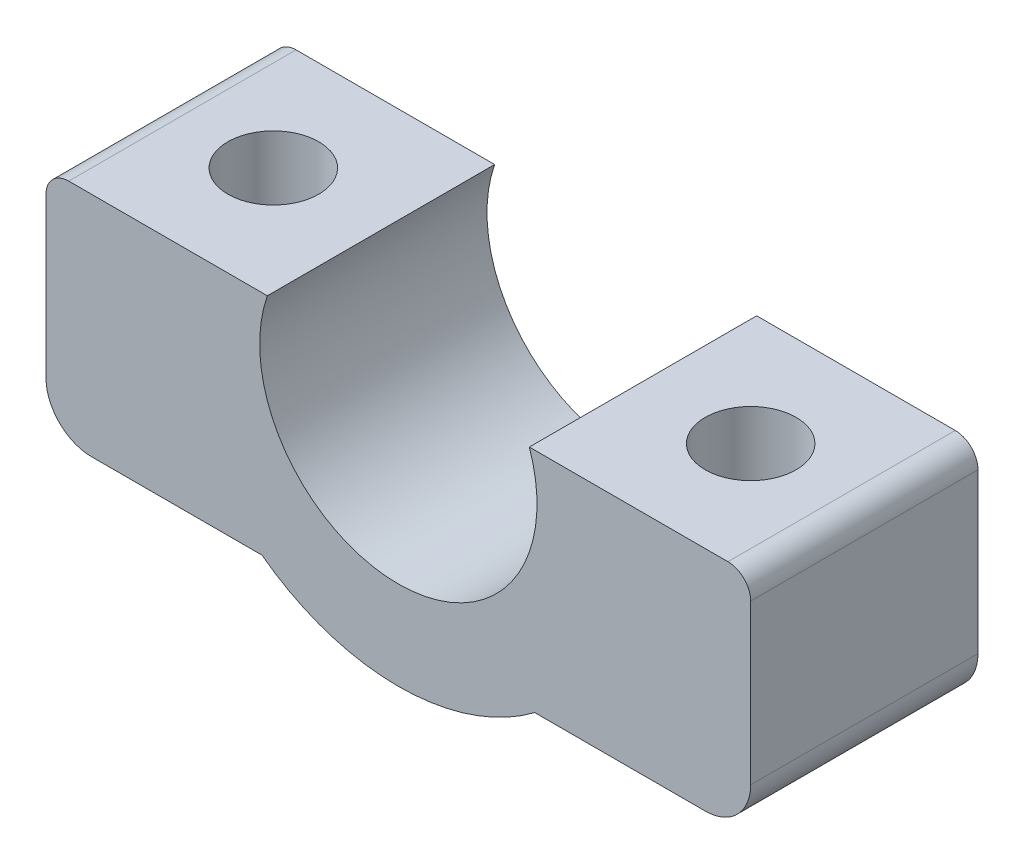
ISO-10303-21;
HEADER;
FILE_DESCRIPTION(('STEP AP214'),'2;1');
FILE_NAME('part.step','',(''),(''),'','','');
FILE_SCHEMA(('AUTOMOTIVE_DESIGN { 1 0 10303 214 1 1 1 1 }'));
ENDSEC;
DATA;
#1=APPLICATION_CONTEXT('core data for automotive mechanical design processes');
#2=APPLICATION_PROTOCOL_DEFINITION('international standard','automotive_design',2000,#1);
#3=PRODUCT_CONTEXT('',#1,'mechanical');
#4=PRODUCT('Part','Part','',(#3));
#5=PRODUCT_RELATED_PRODUCT_CATEGORY('part','',(#4));
#6=PRODUCT_DEFINITION_FORMATION('','',#4);
#7=PRODUCT_DEFINITION_CONTEXT('part definition',#1,'design');
#8=PRODUCT_DEFINITION('design','',#6,#7);
#9=PRODUCT_DEFINITION_SHAPE('','',#8);
#10=(LENGTH_UNIT() NAMED_UNIT(*) SI_UNIT(.MILLI.,.METRE.));
#11=(NAMED_UNIT(*) PLANE_ANGLE_UNIT() SI_UNIT($,.RADIAN.));
#12=(NAMED_UNIT(*) SI_UNIT($,.STERADIAN.) SOLID_ANGLE_UNIT());
#13=UNCERTAINTY_MEASURE_WITH_UNIT(LENGTH_MEASURE(1.E-05),#10,'distance_accuracy_value','');
#14=(GEOMETRIC_REPRESENTATION_CONTEXT(3) GLOBAL_UNCERTAINTY_ASSIGNED_CONTEXT((#13)) GLOBAL_UNIT_ASSIGNED_CONTEXT((#10,
#11,#12)) REPRESENTATION_CONTEXT('',''));
#15=CARTESIAN_POINT('',(0.,0.,0.));
#16=DIRECTION('',(0.,0.,1.));
#17=DIRECTION('',(1.,0.,0.));
#18=AXIS2_PLACEMENT_3D('',#15,#16,#17);
#19=CARTESIAN_POINT('',(-15.3242534559657,-8.,0.));
#20=DIRECTION('',(0.,1.,0.));
#21=DIRECTION('',(0.,0.,1.));
#22=AXIS2_PLACEMENT_3D('',#19,#20,#21);
#23=PLANE('',#22);
#24=CARTESIAN_POINT('',(-10.5,-8.,5.));
#25=DIRECTION('',(0.,1.,0.));
#26=DIRECTION('',(0.,0.,1.));
#27=AXIS2_PLACEMENT_3D('',#24,#25,#26);
#28=CIRCLE('',#27,2.);
#29=CARTESIAN_POINT('',(-10.5,-8.,7.));
#30=VERTEX_POINT('',#29);
#31=EDGE_CURVE('E171',#30,#30,#28,.F.);
#32=ORIENTED_EDGE('',*,*,#31,.F.);
#33=EDGE_LOOP('',(#32));
#34=FACE_BOUND('',#33,.T.);
#35=DIRECTION('',(-1.,0.,0.));
#36=VECTOR('',#35,1.);
#37=CARTESIAN_POINT('',(-15.3242534559657,-8.,10.));
#38=LINE('',#37,#36);
#39=CARTESIAN_POINT('',(-6.,-8.,10.));
#40=VERTEX_POINT('',#39);
#41=CARTESIAN_POINT('',(-13.5,-8.,10.));
#42=VERTEX_POINT('',#41);
#43=EDGE_CURVE('E140',#40,#42,#38,.T.);
#44=ORIENTED_EDGE('',*,*,#43,.T.);
#45=DIRECTION('',(0.,0.,1.));
#46=VECTOR('',#45,1.);
#47=CARTESIAN_POINT('',(-13.5,-8.,0.));
#48=LINE('',#47,#46);
#49=CARTESIAN_POINT('',(-13.5,-8.,0.));
#50=VERTEX_POINT('',#49);
#51=EDGE_CURVE('E208',#42,#50,#48,.F.);
#52=ORIENTED_EDGE('',*,*,#51,.T.);
#53=DIRECTION('',(-1.,0.,0.));
#54=VECTOR('',#53,1.);
#55=CARTESIAN_POINT('',(-15.3242534559657,-8.,0.));
#56=LINE('',#55,#54);
#57=CARTESIAN_POINT('',(-6.,-8.,0.));
#58=VERTEX_POINT('',#57);
#59=EDGE_CURVE('E139',#58,#50,#56,.T.);
#60=ORIENTED_EDGE('',*,*,#59,.F.);
#61=DIRECTION('',(0.,0.,1.));
#62=VECTOR('',#61,1.);
#63=CARTESIAN_POINT('',(-6.,-8.,-12.1655250605964));
#64=LINE('',#63,#62);
#65=EDGE_CURVE('E149',#58,#40,#64,.T.);
#66=ORIENTED_EDGE('',*,*,#65,.T.);
#67=EDGE_LOOP('',(#44,#52,#60,#66));
#68=FACE_BOUND('',#67,.T.);
#69=ADVANCED_FACE('F38',(#34,#68),#23,.F.);
#70=CARTESIAN_POINT('',(0.,0.,10.));
#71=DIRECTION('',(0.,0.,1.));
#72=DIRECTION('',(1.,0.,0.));
#73=AXIS2_PLACEMENT_3D('',#70,#71,#72);
#74=PLANE('',#73);
#75=DIRECTION('',(1.,0.,0.));
#76=VECTOR('',#75,1.);
#77=CARTESIAN_POINT('',(-19.8541118207016,2.,10.));
#78=LINE('',#77,#76);
#79=CARTESIAN_POINT('',(-14.5,2.,10.));
#80=VERTEX_POINT('',#79);
#81=CARTESIAN_POINT('',(-5.76281181368956,2.,10.));
#82=VERTEX_POINT('',#81);
#83=EDGE_CURVE('E185',#80,#82,#78,.T.);
#84=ORIENTED_EDGE('',*,*,#83,.F.);
#85=CARTESIAN_POINT('',(-14.5,1.,10.));
#86=DIRECTION('',(0.,0.,1.));
#87=DIRECTION('',(1.,0.,0.));
#88=AXIS2_PLACEMENT_3D('',#85,#86,#87);
#89=CIRCLE('',#88,1.);
#90=CARTESIAN_POINT('',(-15.5,1.,10.));
#91=VERTEX_POINT('',#90);
#92=EDGE_CURVE('E222',#80,#91,#89,.T.);
#93=ORIENTED_EDGE('',*,*,#92,.T.);
#94=DIRECTION('',(0.,-1.,0.));
#95=VECTOR('',#94,1.);
#96=CARTESIAN_POINT('',(-15.5,0.,10.));
#97=LINE('',#96,#95);
#98=CARTESIAN_POINT('',(-15.5,-6.,10.));
#99=VERTEX_POINT('',#98);
#100=EDGE_CURVE('E161',#91,#99,#97,.T.);
#101=ORIENTED_EDGE('',*,*,#100,.T.);
#102=CARTESIAN_POINT('',(-13.5,-6.,10.));
#103=DIRECTION('',(0.,0.,1.));
#104=DIRECTION('',(1.,0.,0.));
#105=AXIS2_PLACEMENT_3D('',#102,#103,#104);
#106=CIRCLE('',#105,2.);
#107=EDGE_CURVE('E206',#99,#42,#106,.T.);
#108=ORIENTED_EDGE('',*,*,#107,.T.);
#109=ORIENTED_EDGE('',*,*,#43,.F.);
#110=CARTESIAN_POINT('',(0.,0.,10.));
#111=DIRECTION('',(0.,0.,1.));
#112=DIRECTION('',(1.,0.,0.));
#113=AXIS2_PLACEMENT_3D('',#110,#111,#112);
#114=CIRCLE('',#113,10.);
#115=CARTESIAN_POINT('',(6.,-8.,10.));
#116=VERTEX_POINT('',#115);
#117=EDGE_CURVE('E145',#40,#116,#114,.T.);
#118=ORIENTED_EDGE('',*,*,#117,.T.);
#119=CARTESIAN_POINT('',(13.5,-8.,10.));
#120=VERTEX_POINT('',#119);
#121=EDGE_CURVE('E129',#120,#116,#38,.T.);
#122=ORIENTED_EDGE('',*,*,#121,.F.);
#123=CARTESIAN_POINT('',(13.5,-6.,10.));
#124=DIRECTION('',(0.,0.,1.));
#125=DIRECTION('',(1.,0.,0.));
#126=AXIS2_PLACEMENT_3D('',#123,#124,#125);
#127=CIRCLE('',#126,2.);
#128=CARTESIAN_POINT('',(15.5,-6.,10.));
#129=VERTEX_POINT('',#128);
#130=EDGE_CURVE('E204',#120,#129,#127,.T.);
#131=ORIENTED_EDGE('',*,*,#130,.T.);
#132=DIRECTION('',(0.,-1.,0.));
#133=VECTOR('',#132,1.);
#134=CARTESIAN_POINT('',(15.5,0.,10.));
#135=LINE('',#134,#133);
#136=CARTESIAN_POINT('',(15.5,1.,10.));
#137=VERTEX_POINT('',#136);
#138=EDGE_CURVE('E162',#137,#129,#135,.T.);
#139=ORIENTED_EDGE('',*,*,#138,.F.);
#140=CARTESIAN_POINT('',(14.5,1.,10.));
#141=DIRECTION('',(0.,0.,1.));
#142=DIRECTION('',(1.,0.,0.));
#143=AXIS2_PLACEMENT_3D('',#140,#141,#142);
#144=CIRCLE('',#143,1.);
#145=CARTESIAN_POINT('',(14.5,2.,10.));
#146=VERTEX_POINT('',#145);
#147=EDGE_CURVE('E220',#137,#146,#144,.T.);
#148=ORIENTED_EDGE('',*,*,#147,.T.);
#149=DIRECTION('',(1.,0.,0.));
#150=VECTOR('',#149,1.);
#151=CARTESIAN_POINT('',(5.76281181368956,2.,10.));
#152=LINE('',#151,#150);
#153=CARTESIAN_POINT('',(5.76281181368956,2.,10.));
#154=VERTEX_POINT('',#153);
#155=EDGE_CURVE('E190',#154,#146,#152,.T.);
#156=ORIENTED_EDGE('',*,*,#155,.F.);
#157=CARTESIAN_POINT('',(0.,0.,10.));
#158=DIRECTION('',(0.,0.,1.));
#159=DIRECTION('',(1.,0.,0.));
#160=AXIS2_PLACEMENT_3D('',#157,#158,#159);
#161=CIRCLE('',#160,6.1);
#162=EDGE_CURVE('E180',#82,#154,#161,.T.);
#163=ORIENTED_EDGE('',*,*,#162,.F.);
#164=EDGE_LOOP('',(#84,#93,#101,#108,#109,#118,#122,#131,#139,#148,#156,#163));
#165=FACE_BOUND('',#164,.T.);
#166=ADVANCED_FACE('F153',(#165),#74,.T.);
#167=CARTESIAN_POINT('',(0.,0.,0.));
#168=DIRECTION('',(0.,0.,1.));
#169=DIRECTION('',(1.,0.,0.));
#170=AXIS2_PLACEMENT_3D('',#167,#168,#169);
#171=PLANE('',#170);
#172=DIRECTION('',(0.,1.,0.));
#173=VECTOR('',#172,1.);
#174=CARTESIAN_POINT('',(-15.5,0.,0.));
#175=LINE('',#174,#173);
#176=CARTESIAN_POINT('',(-15.5,-6.,0.));
#177=VERTEX_POINT('',#176);
#178=CARTESIAN_POINT('',(-15.5,1.,0.));
#179=VERTEX_POINT('',#178);
#180=EDGE_CURVE('E164',#177,#179,#175,.T.);
#181=ORIENTED_EDGE('',*,*,#180,.T.);
#182=CARTESIAN_POINT('',(-14.5,1.,0.));
#183=DIRECTION('',(0.,0.,1.));
#184=DIRECTION('',(1.,0.,0.));
#185=AXIS2_PLACEMENT_3D('',#182,#183,#184);
#186=CIRCLE('',#185,1.);
#187=CARTESIAN_POINT('',(-14.5,2.,0.));
#188=VERTEX_POINT('',#187);
#189=EDGE_CURVE('E227',#179,#188,#186,.F.);
#190=ORIENTED_EDGE('',*,*,#189,.T.);
#191=DIRECTION('',(1.,0.,0.));
#192=VECTOR('',#191,1.);
#193=CARTESIAN_POINT('',(0.,2.,0.));
#194=LINE('',#193,#192);
#195=CARTESIAN_POINT('',(-5.76281181368956,2.,0.));
#196=VERTEX_POINT('',#195);
#197=EDGE_CURVE('E196',#188,#196,#194,.T.);
#198=ORIENTED_EDGE('',*,*,#197,.T.);
#199=CARTESIAN_POINT('',(0.,0.,0.));
#200=DIRECTION('',(0.,0.,1.));
#201=DIRECTION('',(1.,0.,0.));
#202=AXIS2_PLACEMENT_3D('',#199,#200,#201);
#203=CIRCLE('',#202,6.1);
#204=CARTESIAN_POINT('',(5.76281181368956,2.,0.));
#205=VERTEX_POINT('',#204);
#206=EDGE_CURVE('E181',#196,#205,#203,.T.);
#207=ORIENTED_EDGE('',*,*,#206,.T.);
#208=DIRECTION('',(1.,0.,0.));
#209=VECTOR('',#208,1.);
#210=CARTESIAN_POINT('',(5.76281181368956,2.,0.));
#211=LINE('',#210,#209);
#212=CARTESIAN_POINT('',(14.5,2.,0.));
#213=VERTEX_POINT('',#212);
#214=EDGE_CURVE('E184',#205,#213,#211,.T.);
#215=ORIENTED_EDGE('',*,*,#214,.T.);
#216=CARTESIAN_POINT('',(14.5,1.,0.));
#217=DIRECTION('',(0.,0.,1.));
#218=DIRECTION('',(1.,0.,0.));
#219=AXIS2_PLACEMENT_3D('',#216,#217,#218);
#220=CIRCLE('',#219,1.);
#221=CARTESIAN_POINT('',(15.5,1.,0.));
#222=VERTEX_POINT('',#221);
#223=EDGE_CURVE('E53',#213,#222,#220,.F.);
#224=ORIENTED_EDGE('',*,*,#223,.T.);
#225=DIRECTION('',(0.,1.,0.));
#226=VECTOR('',#225,1.);
#227=CARTESIAN_POINT('',(15.5,0.,0.));
#228=LINE('',#227,#226);
#229=CARTESIAN_POINT('',(15.5,-6.,0.));
#230=VERTEX_POINT('',#229);
#231=EDGE_CURVE('E159',#230,#222,#228,.T.);
#232=ORIENTED_EDGE('',*,*,#231,.F.);
#233=CARTESIAN_POINT('',(13.5,-6.,0.));
#234=DIRECTION('',(0.,0.,1.));
#235=DIRECTION('',(1.,0.,0.));
#236=AXIS2_PLACEMENT_3D('',#233,#234,#235);
#237=CIRCLE('',#236,2.);
#238=CARTESIAN_POINT('',(13.5,-8.,0.));
#239=VERTEX_POINT('',#238);
#240=EDGE_CURVE('E210',#230,#239,#237,.F.);
#241=ORIENTED_EDGE('',*,*,#240,.T.);
#242=CARTESIAN_POINT('',(6.,-8.,0.));
#243=VERTEX_POINT('',#242);
#244=EDGE_CURVE('E168',#239,#243,#56,.T.);
#245=ORIENTED_EDGE('',*,*,#244,.T.);
#246=CARTESIAN_POINT('',(0.,0.,0.));
#247=DIRECTION('',(0.,0.,1.));
#248=DIRECTION('',(1.,0.,0.));
#249=AXIS2_PLACEMENT_3D('',#246,#247,#248);
#250=CIRCLE('',#249,10.);
#251=EDGE_CURVE('E148',#243,#58,#250,.F.);
#252=ORIENTED_EDGE('',*,*,#251,.T.);
#253=ORIENTED_EDGE('',*,*,#59,.T.);
#254=CARTESIAN_POINT('',(-13.5,-6.,0.));
#255=DIRECTION('',(0.,0.,1.));
#256=DIRECTION('',(1.,0.,0.));
#257=AXIS2_PLACEMENT_3D('',#254,#255,#256);
#258=CIRCLE('',#257,2.);
#259=EDGE_CURVE('E212',#50,#177,#258,.F.);
#260=ORIENTED_EDGE('',*,*,#259,.T.);
#261=EDGE_LOOP('',(#181,#190,#198,#207,#215,#224,#232,#241,#245,#252,#253,#260));
#262=FACE_BOUND('',#261,.T.);
#263=ADVANCED_FACE('F239',(#262),#171,.F.);
#264=CARTESIAN_POINT('',(-19.8541118207016,2.,0.));
#265=DIRECTION('',(0.,-1.,0.));
#266=DIRECTION('',(0.,0.,-1.));
#267=AXIS2_PLACEMENT_3D('',#264,#265,#266);
#268=PLANE('',#267);
#269=CARTESIAN_POINT('',(-10.5,2.,5.));
#270=DIRECTION('',(0.,1.,0.));
#271=DIRECTION('',(0.,0.,1.));
#272=AXIS2_PLACEMENT_3D('',#269,#270,#271);
#273=CIRCLE('',#272,2.);
#274=CARTESIAN_POINT('',(-10.5,2.,7.));
#275=VERTEX_POINT('',#274);
#276=EDGE_CURVE('E177',#275,#275,#273,.T.);
#277=ORIENTED_EDGE('',*,*,#276,.F.);
#278=EDGE_LOOP('',(#277));
#279=FACE_BOUND('',#278,.T.);
#280=ORIENTED_EDGE('',*,*,#197,.F.);
#281=DIRECTION('',(0.,0.,1.));
#282=VECTOR('',#281,1.);
#283=CARTESIAN_POINT('',(-14.5,2.,10.));
#284=LINE('',#283,#282);
#285=EDGE_CURVE('E217',#188,#80,#284,.T.);
#286=ORIENTED_EDGE('',*,*,#285,.T.);
#287=ORIENTED_EDGE('',*,*,#83,.T.);
#288=DIRECTION('',(0.,0.,1.));
#289=VECTOR('',#288,1.);
#290=CARTESIAN_POINT('',(-5.76281181368956,2.,0.));
#291=LINE('',#290,#289);
#292=EDGE_CURVE('E193',#196,#82,#291,.T.);
#293=ORIENTED_EDGE('',*,*,#292,.F.);
#294=EDGE_LOOP('',(#280,#286,#287,#293));
#295=FACE_BOUND('',#294,.T.);
#296=ADVANCED_FACE('F261',(#279,#295),#268,.F.);
#297=CARTESIAN_POINT('',(5.76281181368956,2.,0.));
#298=DIRECTION('',(0.,-1.,0.));
#299=DIRECTION('',(0.,0.,-1.));
#300=AXIS2_PLACEMENT_3D('',#297,#298,#299);
#301=PLANE('',#300);
#302=CARTESIAN_POINT('',(10.5,2.,5.));
#303=DIRECTION('',(0.,1.,0.));
#304=DIRECTION('',(0.,0.,1.));
#305=AXIS2_PLACEMENT_3D('',#302,#303,#304);
#306=CIRCLE('',#305,2.);
#307=CARTESIAN_POINT('',(10.5,2.,7.));
#308=VERTEX_POINT('',#307);
#309=EDGE_CURVE('E174',#308,#308,#306,.T.);
#310=ORIENTED_EDGE('',*,*,#309,.F.);
#311=EDGE_LOOP('',(#310));
#312=FACE_BOUND('',#311,.T.);
#313=ORIENTED_EDGE('',*,*,#155,.T.);
#314=DIRECTION('',(0.,0.,1.));
#315=VECTOR('',#314,1.);
#316=CARTESIAN_POINT('',(14.5,2.,0.));
#317=LINE('',#316,#315);
#318=EDGE_CURVE('E11',#146,#213,#317,.F.);
#319=ORIENTED_EDGE('',*,*,#318,.T.);
#320=ORIENTED_EDGE('',*,*,#214,.F.);
#321=DIRECTION('',(0.,0.,1.));
#322=VECTOR('',#321,1.);
#323=CARTESIAN_POINT('',(5.76281181368956,2.,0.));
#324=LINE('',#323,#322);
#325=EDGE_CURVE('E187',#205,#154,#324,.T.);
#326=ORIENTED_EDGE('',*,*,#325,.T.);
#327=EDGE_LOOP('',(#313,#319,#320,#326));
#328=FACE_BOUND('',#327,.T.);
#329=ADVANCED_FACE('F293',(#312,#328),#301,.F.);
#330=CARTESIAN_POINT('',(0.,0.,0.));
#331=DIRECTION('',(0.,0.,1.));
#332=DIRECTION('',(1.,0.,0.));
#333=AXIS2_PLACEMENT_3D('',#330,#331,#332);
#334=CYLINDRICAL_SURFACE('',#333,6.1);
#335=ORIENTED_EDGE('',*,*,#162,.T.);
#336=ORIENTED_EDGE('',*,*,#325,.F.);
#337=ORIENTED_EDGE('',*,*,#206,.F.);
#338=ORIENTED_EDGE('',*,*,#292,.T.);
#339=EDGE_LOOP('',(#335,#336,#337,#338));
#340=FACE_BOUND('',#339,.T.);
#341=ADVANCED_FACE('F265',(#340),#334,.F.);
#342=CARTESIAN_POINT('',(-10.5,-15.,5.));
#343=DIRECTION('',(0.,1.,0.));
#344=DIRECTION('',(0.,0.,1.));
#345=AXIS2_PLACEMENT_3D('',#342,#343,#344);
#346=CYLINDRICAL_SURFACE('',#345,2.);
#347=ORIENTED_EDGE('',*,*,#31,.T.);
#348=EDGE_LOOP('',(#347));
#349=FACE_BOUND('',#348,.T.);
#350=ORIENTED_EDGE('',*,*,#276,.T.);
#351=EDGE_LOOP('',(#350));
#352=FACE_BOUND('',#351,.T.);
#353=ADVANCED_FACE('F287',(#349,#352),#346,.F.);
#354=CARTESIAN_POINT('',(10.5,-15.,5.));
#355=DIRECTION('',(0.,1.,0.));
#356=DIRECTION('',(0.,0.,1.));
#357=AXIS2_PLACEMENT_3D('',#354,#355,#356);
#358=CYLINDRICAL_SURFACE('',#357,2.);
#359=CARTESIAN_POINT('',(10.5,-8.,5.));
#360=DIRECTION('',(0.,1.,0.));
#361=DIRECTION('',(0.,0.,1.));
#362=AXIS2_PLACEMENT_3D('',#359,#360,#361);
#363=CIRCLE('',#362,2.);
#364=CARTESIAN_POINT('',(10.5,-8.,7.));
#365=VERTEX_POINT('',#364);
#366=EDGE_CURVE('E169',#365,#365,#363,.F.);
#367=ORIENTED_EDGE('',*,*,#366,.T.);
#368=EDGE_LOOP('',(#367));
#369=FACE_BOUND('',#368,.T.);
#370=ORIENTED_EDGE('',*,*,#309,.T.);
#371=EDGE_LOOP('',(#370));
#372=FACE_BOUND('',#371,.T.);
#373=ADVANCED_FACE('F281',(#369,#372),#358,.F.);
#374=ORIENTED_EDGE('',*,*,#366,.F.);
#375=EDGE_LOOP('',(#374));
#376=FACE_BOUND('',#375,.T.);
#377=ORIENTED_EDGE('',*,*,#244,.F.);
#378=DIRECTION('',(0.,0.,1.));
#379=VECTOR('',#378,1.);
#380=CARTESIAN_POINT('',(13.5,-8.,0.));
#381=LINE('',#380,#379);
#382=EDGE_CURVE('E135',#239,#120,#381,.T.);
#383=ORIENTED_EDGE('',*,*,#382,.T.);
#384=ORIENTED_EDGE('',*,*,#121,.T.);
#385=DIRECTION('',(0.,0.,1.));
#386=VECTOR('',#385,1.);
#387=CARTESIAN_POINT('',(6.,-8.,-12.1655250605964));
#388=LINE('',#387,#386);
#389=EDGE_CURVE('E133',#243,#116,#388,.T.);
#390=ORIENTED_EDGE('',*,*,#389,.F.);
#391=EDGE_LOOP('',(#377,#383,#384,#390));
#392=FACE_BOUND('',#391,.T.);
#393=ADVANCED_FACE('F132',(#376,#392),#23,.F.);
#394=CARTESIAN_POINT('',(-15.5,0.,-10.3876896491022));
#395=DIRECTION('',(-1.,0.,0.));
#396=DIRECTION('',(0.,-1.,0.));
#397=AXIS2_PLACEMENT_3D('',#394,#395,#396);
#398=PLANE('',#397);
#399=ORIENTED_EDGE('',*,*,#100,.F.);
#400=DIRECTION('',(0.,0.,1.));
#401=VECTOR('',#400,1.);
#402=CARTESIAN_POINT('',(-15.5,1.,0.));
#403=LINE('',#402,#401);
#404=EDGE_CURVE('E224',#91,#179,#403,.F.);
#405=ORIENTED_EDGE('',*,*,#404,.T.);
#406=ORIENTED_EDGE('',*,*,#180,.F.);
#407=DIRECTION('',(0.,0.,1.));
#408=VECTOR('',#407,1.);
#409=CARTESIAN_POINT('',(-15.5,-6.,10.));
#410=LINE('',#409,#408);
#411=EDGE_CURVE('E199',#177,#99,#410,.T.);
#412=ORIENTED_EDGE('',*,*,#411,.T.);
#413=EDGE_LOOP('',(#399,#405,#406,#412));
#414=FACE_BOUND('',#413,.T.);
#415=ADVANCED_FACE('F253',(#414),#398,.T.);
#416=CARTESIAN_POINT('',(15.5,0.,-10.3876896491022));
#417=DIRECTION('',(-1.,0.,0.));
#418=DIRECTION('',(0.,-1.,0.));
#419=AXIS2_PLACEMENT_3D('',#416,#417,#418);
#420=PLANE('',#419);
#421=ORIENTED_EDGE('',*,*,#231,.T.);
#422=DIRECTION('',(0.,0.,1.));
#423=VECTOR('',#422,1.);
#424=CARTESIAN_POINT('',(15.5,1.,-10.3876896491022));
#425=LINE('',#424,#423);
#426=EDGE_CURVE('E46',#222,#137,#425,.T.);
#427=ORIENTED_EDGE('',*,*,#426,.T.);
#428=ORIENTED_EDGE('',*,*,#138,.T.);
#429=DIRECTION('',(0.,0.,1.));
#430=VECTOR('',#429,1.);
#431=CARTESIAN_POINT('',(15.5,-6.,-10.3876896491022));
#432=LINE('',#431,#430);
#433=EDGE_CURVE('E215',#129,#230,#432,.F.);
#434=ORIENTED_EDGE('',*,*,#433,.T.);
#435=EDGE_LOOP('',(#421,#427,#428,#434));
#436=FACE_BOUND('',#435,.T.);
#437=ADVANCED_FACE('F232',(#436),#420,.F.);
#438=CARTESIAN_POINT('',(0.,0.,-12.1655250605964));
#439=DIRECTION('',(0.,0.,1.));
#440=DIRECTION('',(1.,0.,0.));
#441=AXIS2_PLACEMENT_3D('',#438,#439,#440);
#442=CYLINDRICAL_SURFACE('',#441,10.);
#443=ORIENTED_EDGE('',*,*,#251,.F.);
#444=ORIENTED_EDGE('',*,*,#389,.T.);
#445=ORIENTED_EDGE('',*,*,#117,.F.);
#446=ORIENTED_EDGE('',*,*,#65,.F.);
#447=EDGE_LOOP('',(#443,#444,#445,#446));
#448=FACE_BOUND('',#447,.T.);
#449=ADVANCED_FACE('F144',(#448),#442,.T.);
#450=CARTESIAN_POINT('',(-13.5,-6.,-10.3876896491022));
#451=DIRECTION('',(0.,0.,-1.));
#452=DIRECTION('',(-1.,0.,0.));
#453=AXIS2_PLACEMENT_3D('',#450,#451,#452);
#454=CYLINDRICAL_SURFACE('',#453,2.);
#455=ORIENTED_EDGE('',*,*,#259,.F.);
#456=ORIENTED_EDGE('',*,*,#51,.F.);
#457=ORIENTED_EDGE('',*,*,#107,.F.);
#458=ORIENTED_EDGE('',*,*,#411,.F.);
#459=EDGE_LOOP('',(#455,#456,#457,#458));
#460=FACE_BOUND('',#459,.T.);
#461=ADVANCED_FACE('F247',(#460),#454,.T.);
#462=CARTESIAN_POINT('',(13.5,-6.,0.));
#463=DIRECTION('',(0.,0.,1.));
#464=DIRECTION('',(1.,0.,0.));
#465=AXIS2_PLACEMENT_3D('',#462,#463,#464);
#466=CYLINDRICAL_SURFACE('',#465,2.);
#467=ORIENTED_EDGE('',*,*,#240,.F.);
#468=ORIENTED_EDGE('',*,*,#433,.F.);
#469=ORIENTED_EDGE('',*,*,#130,.F.);
#470=ORIENTED_EDGE('',*,*,#382,.F.);
#471=EDGE_LOOP('',(#467,#468,#469,#470));
#472=FACE_BOUND('',#471,.T.);
#473=ADVANCED_FACE('F238',(#472),#466,.T.);
#474=CARTESIAN_POINT('',(-14.5,1.,0.));
#475=DIRECTION('',(0.,0.,-1.));
#476=DIRECTION('',(-1.,0.,0.));
#477=AXIS2_PLACEMENT_3D('',#474,#475,#476);
#478=CYLINDRICAL_SURFACE('',#477,1.);
#479=ORIENTED_EDGE('',*,*,#189,.F.);
#480=ORIENTED_EDGE('',*,*,#404,.F.);
#481=ORIENTED_EDGE('',*,*,#92,.F.);
#482=ORIENTED_EDGE('',*,*,#285,.F.);
#483=EDGE_LOOP('',(#479,#480,#481,#482));
#484=FACE_BOUND('',#483,.T.);
#485=ADVANCED_FACE('F256',(#484),#478,.T.);
#486=CARTESIAN_POINT('',(14.5,1.,-10.3876896491022));
#487=DIRECTION('',(0.,0.,1.));
#488=DIRECTION('',(1.,0.,0.));
#489=AXIS2_PLACEMENT_3D('',#486,#487,#488);
#490=CYLINDRICAL_SURFACE('',#489,1.);
#491=ORIENTED_EDGE('',*,*,#223,.F.);
#492=ORIENTED_EDGE('',*,*,#318,.F.);
#493=ORIENTED_EDGE('',*,*,#147,.F.);
#494=ORIENTED_EDGE('',*,*,#426,.F.);
#495=EDGE_LOOP('',(#491,#492,#493,#494));
#496=FACE_BOUND('',#495,.T.);
#497=ADVANCED_FACE('F40',(#496),#490,.T.);
#498=CLOSED_SHELL('',(#69,#166,#263,#296,#329,#341,#353,#373,#393,#415,#437,#449,#461,#473,#485,#497));
#499=MANIFOLD_SOLID_BREP('B2',#498);
#500=ADVANCED_BREP_SHAPE_REPRESENTATION('',(#18,#499),#14);
#501=SHAPE_DEFINITION_REPRESENTATION(#9,#500);
ENDSEC;
END-ISO-10303-21;
